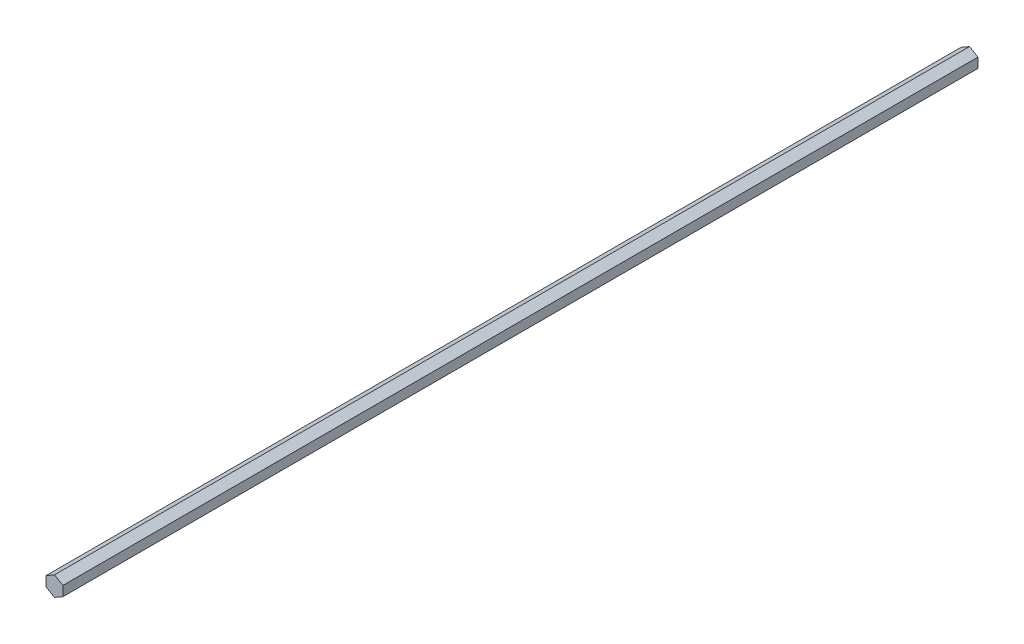
ISO-10303-21;
HEADER;
FILE_DESCRIPTION(('STEP AP214'),'2;1');
FILE_NAME('part.step','',(''),(''),'','','');
FILE_SCHEMA(('AUTOMOTIVE_DESIGN { 1 0 10303 214 1 1 1 1 }'));
ENDSEC;
DATA;
#1=APPLICATION_CONTEXT('core data for automotive mechanical design processes');
#2=APPLICATION_PROTOCOL_DEFINITION('international standard','automotive_design',2000,#1);
#3=PRODUCT_CONTEXT('',#1,'mechanical');
#4=PRODUCT('Part','Part','',(#3));
#5=PRODUCT_RELATED_PRODUCT_CATEGORY('part','',(#4));
#6=PRODUCT_DEFINITION_FORMATION('','',#4);
#7=PRODUCT_DEFINITION_CONTEXT('part definition',#1,'design');
#8=PRODUCT_DEFINITION('design','',#6,#7);
#9=PRODUCT_DEFINITION_SHAPE('','',#8);
#10=(LENGTH_UNIT() NAMED_UNIT(*) SI_UNIT(.MILLI.,.METRE.));
#11=(NAMED_UNIT(*) PLANE_ANGLE_UNIT() SI_UNIT($,.RADIAN.));
#12=(NAMED_UNIT(*) SI_UNIT($,.STERADIAN.) SOLID_ANGLE_UNIT());
#13=UNCERTAINTY_MEASURE_WITH_UNIT(LENGTH_MEASURE(1.E-05),#10,'distance_accuracy_value','');
#14=(GEOMETRIC_REPRESENTATION_CONTEXT(3) GLOBAL_UNCERTAINTY_ASSIGNED_CONTEXT((#13)) GLOBAL_UNIT_ASSIGNED_CONTEXT((#10,
#11,#12)) REPRESENTATION_CONTEXT('',''));
#15=CARTESIAN_POINT('',(0.,0.,0.));
#16=DIRECTION('',(0.,0.,1.));
#17=DIRECTION('',(1.,0.,0.));
#18=AXIS2_PLACEMENT_3D('',#15,#16,#17);
#19=CARTESIAN_POINT('',(6.35,-3.66617420935412,342.9));
#20=DIRECTION('',(-1.,0.,0.));
#21=DIRECTION('',(0.,-1.,0.));
#22=AXIS2_PLACEMENT_3D('',#19,#20,#21);
#23=PLANE('',#22);
#24=DIRECTION('',(0.,1.,0.));
#25=VECTOR('',#24,1.);
#26=CARTESIAN_POINT('',(6.35,-3.66617420935412,-342.9));
#27=LINE('',#26,#25);
#28=CARTESIAN_POINT('',(6.35,-3.66617420935412,-342.9));
#29=VERTEX_POINT('',#28);
#30=CARTESIAN_POINT('',(6.35,3.66617420935412,-342.9));
#31=VERTEX_POINT('',#30);
#32=EDGE_CURVE('E134',#29,#31,#27,.T.);
#33=ORIENTED_EDGE('',*,*,#32,.T.);
#34=DIRECTION('',(0.,0.,-1.));
#35=VECTOR('',#34,1.);
#36=CARTESIAN_POINT('',(6.35,3.66617420935412,342.9));
#37=LINE('',#36,#35);
#38=CARTESIAN_POINT('',(6.35,3.66617420935412,342.9));
#39=VERTEX_POINT('',#38);
#40=EDGE_CURVE('E11',#39,#31,#37,.T.);
#41=ORIENTED_EDGE('',*,*,#40,.F.);
#42=DIRECTION('',(0.,1.,0.));
#43=VECTOR('',#42,1.);
#44=CARTESIAN_POINT('',(6.35,-3.66617420935412,342.9));
#45=LINE('',#44,#43);
#46=CARTESIAN_POINT('',(6.35,-3.66617420935412,342.9));
#47=VERTEX_POINT('',#46);
#48=EDGE_CURVE('E150',#47,#39,#45,.T.);
#49=ORIENTED_EDGE('',*,*,#48,.F.);
#50=DIRECTION('',(0.,0.,-1.));
#51=VECTOR('',#50,1.);
#52=CARTESIAN_POINT('',(6.35,-3.66617420935412,342.9));
#53=LINE('',#52,#51);
#54=EDGE_CURVE('E130',#47,#29,#53,.T.);
#55=ORIENTED_EDGE('',*,*,#54,.T.);
#56=EDGE_LOOP('',(#33,#41,#49,#55));
#57=FACE_BOUND('',#56,.T.);
#58=ADVANCED_FACE('F45',(#57),#23,.F.);
#59=CARTESIAN_POINT('',(6.35,3.66617420935412,342.9));
#60=DIRECTION('',(-0.5,-0.866025403784439,0.));
#61=DIRECTION('',(0.866025403784439,-0.5,0.));
#62=AXIS2_PLACEMENT_3D('',#59,#60,#61);
#63=PLANE('',#62);
#64=DIRECTION('',(-0.866025403784439,0.5,0.));
#65=VECTOR('',#64,1.);
#66=CARTESIAN_POINT('',(6.35,3.66617420935412,-342.9));
#67=LINE('',#66,#65);
#68=CARTESIAN_POINT('',(0.,7.33234841870825,-342.9));
#69=VERTEX_POINT('',#68);
#70=EDGE_CURVE('E138',#31,#69,#67,.T.);
#71=ORIENTED_EDGE('',*,*,#70,.T.);
#72=DIRECTION('',(0.,0.,-1.));
#73=VECTOR('',#72,1.);
#74=CARTESIAN_POINT('',(0.,7.33234841870825,342.9));
#75=LINE('',#74,#73);
#76=CARTESIAN_POINT('',(0.,7.33234841870825,342.9));
#77=VERTEX_POINT('',#76);
#78=EDGE_CURVE('E54',#77,#69,#75,.T.);
#79=ORIENTED_EDGE('',*,*,#78,.F.);
#80=DIRECTION('',(-0.866025403784439,0.5,0.));
#81=VECTOR('',#80,1.);
#82=CARTESIAN_POINT('',(6.35,3.66617420935412,342.9));
#83=LINE('',#82,#81);
#84=EDGE_CURVE('E99',#39,#77,#83,.T.);
#85=ORIENTED_EDGE('',*,*,#84,.F.);
#86=ORIENTED_EDGE('',*,*,#40,.T.);
#87=EDGE_LOOP('',(#71,#79,#85,#86));
#88=FACE_BOUND('',#87,.T.);
#89=ADVANCED_FACE('F178',(#88),#63,.F.);
#90=CARTESIAN_POINT('',(0.,7.33234841870825,342.9));
#91=DIRECTION('',(0.5,-0.866025403784439,0.));
#92=DIRECTION('',(0.866025403784439,0.5,0.));
#93=AXIS2_PLACEMENT_3D('',#90,#91,#92);
#94=PLANE('',#93);
#95=DIRECTION('',(-0.866025403784439,-0.5,0.));
#96=VECTOR('',#95,1.);
#97=CARTESIAN_POINT('',(0.,7.33234841870825,-342.9));
#98=LINE('',#97,#96);
#99=CARTESIAN_POINT('',(-6.35,3.66617420935412,-342.9));
#100=VERTEX_POINT('',#99);
#101=EDGE_CURVE('E141',#69,#100,#98,.T.);
#102=ORIENTED_EDGE('',*,*,#101,.T.);
#103=DIRECTION('',(0.,0.,-1.));
#104=VECTOR('',#103,1.);
#105=CARTESIAN_POINT('',(-6.35,3.66617420935412,342.9));
#106=LINE('',#105,#104);
#107=CARTESIAN_POINT('',(-6.35,3.66617420935412,342.9));
#108=VERTEX_POINT('',#107);
#109=EDGE_CURVE('E123',#108,#100,#106,.T.);
#110=ORIENTED_EDGE('',*,*,#109,.F.);
#111=DIRECTION('',(-0.866025403784439,-0.5,0.));
#112=VECTOR('',#111,1.);
#113=CARTESIAN_POINT('',(0.,7.33234841870825,342.9));
#114=LINE('',#113,#112);
#115=EDGE_CURVE('E112',#77,#108,#114,.T.);
#116=ORIENTED_EDGE('',*,*,#115,.F.);
#117=ORIENTED_EDGE('',*,*,#78,.T.);
#118=EDGE_LOOP('',(#102,#110,#116,#117));
#119=FACE_BOUND('',#118,.T.);
#120=ADVANCED_FACE('F160',(#119),#94,.F.);
#121=CARTESIAN_POINT('',(-6.35,3.66617420935412,342.9));
#122=DIRECTION('',(1.,0.,0.));
#123=DIRECTION('',(0.,1.,0.));
#124=AXIS2_PLACEMENT_3D('',#121,#122,#123);
#125=PLANE('',#124);
#126=DIRECTION('',(0.,-1.,0.));
#127=VECTOR('',#126,1.);
#128=CARTESIAN_POINT('',(-6.35,3.66617420935412,-342.9));
#129=LINE('',#128,#127);
#130=CARTESIAN_POINT('',(-6.35,-3.66617420935412,-342.9));
#131=VERTEX_POINT('',#130);
#132=EDGE_CURVE('E121',#100,#131,#129,.T.);
#133=ORIENTED_EDGE('',*,*,#132,.T.);
#134=DIRECTION('',(0.,0.,-1.));
#135=VECTOR('',#134,1.);
#136=CARTESIAN_POINT('',(-6.35,-3.66617420935412,342.9));
#137=LINE('',#136,#135);
#138=CARTESIAN_POINT('',(-6.35,-3.66617420935412,342.9));
#139=VERTEX_POINT('',#138);
#140=EDGE_CURVE('E118',#139,#131,#137,.T.);
#141=ORIENTED_EDGE('',*,*,#140,.F.);
#142=DIRECTION('',(0.,-1.,0.));
#143=VECTOR('',#142,1.);
#144=CARTESIAN_POINT('',(-6.35,3.66617420935412,342.9));
#145=LINE('',#144,#143);
#146=EDGE_CURVE('E106',#108,#139,#145,.T.);
#147=ORIENTED_EDGE('',*,*,#146,.F.);
#148=ORIENTED_EDGE('',*,*,#109,.T.);
#149=EDGE_LOOP('',(#133,#141,#147,#148));
#150=FACE_BOUND('',#149,.T.);
#151=ADVANCED_FACE('F119',(#150),#125,.F.);
#152=CARTESIAN_POINT('',(-6.35,-3.66617420935412,342.9));
#153=DIRECTION('',(0.5,0.866025403784439,0.));
#154=DIRECTION('',(-0.866025403784439,0.5,0.));
#155=AXIS2_PLACEMENT_3D('',#152,#153,#154);
#156=PLANE('',#155);
#157=DIRECTION('',(0.866025403784439,-0.5,0.));
#158=VECTOR('',#157,1.);
#159=CARTESIAN_POINT('',(-6.35,-3.66617420935412,-342.9));
#160=LINE('',#159,#158);
#161=CARTESIAN_POINT('',(0.,-7.33234841870825,-342.9));
#162=VERTEX_POINT('',#161);
#163=EDGE_CURVE('E85',#131,#162,#160,.T.);
#164=ORIENTED_EDGE('',*,*,#163,.T.);
#165=DIRECTION('',(0.,0.,-1.));
#166=VECTOR('',#165,1.);
#167=CARTESIAN_POINT('',(0.,-7.33234841870825,342.9));
#168=LINE('',#167,#166);
#169=CARTESIAN_POINT('',(0.,-7.33234841870825,342.9));
#170=VERTEX_POINT('',#169);
#171=EDGE_CURVE('E124',#170,#162,#168,.T.);
#172=ORIENTED_EDGE('',*,*,#171,.F.);
#173=DIRECTION('',(0.866025403784439,-0.5,0.));
#174=VECTOR('',#173,1.);
#175=CARTESIAN_POINT('',(-6.35,-3.66617420935412,342.9));
#176=LINE('',#175,#174);
#177=EDGE_CURVE('E110',#139,#170,#176,.T.);
#178=ORIENTED_EDGE('',*,*,#177,.F.);
#179=ORIENTED_EDGE('',*,*,#140,.T.);
#180=EDGE_LOOP('',(#164,#172,#178,#179));
#181=FACE_BOUND('',#180,.T.);
#182=ADVANCED_FACE('F126',(#181),#156,.F.);
#183=CARTESIAN_POINT('',(0.,-7.33234841870825,342.9));
#184=DIRECTION('',(-0.5,0.866025403784439,0.));
#185=DIRECTION('',(-0.866025403784439,-0.5,0.));
#186=AXIS2_PLACEMENT_3D('',#183,#184,#185);
#187=PLANE('',#186);
#188=DIRECTION('',(0.866025403784438,0.5,0.));
#189=VECTOR('',#188,1.);
#190=CARTESIAN_POINT('',(0.,-7.33234841870825,-342.9));
#191=LINE('',#190,#189);
#192=EDGE_CURVE('E91',#162,#29,#191,.T.);
#193=ORIENTED_EDGE('',*,*,#192,.T.);
#194=ORIENTED_EDGE('',*,*,#54,.F.);
#195=DIRECTION('',(0.866025403784438,0.5,0.));
#196=VECTOR('',#195,1.);
#197=CARTESIAN_POINT('',(0.,-7.33234841870825,342.9));
#198=LINE('',#197,#196);
#199=EDGE_CURVE('E62',#170,#47,#198,.T.);
#200=ORIENTED_EDGE('',*,*,#199,.F.);
#201=ORIENTED_EDGE('',*,*,#171,.T.);
#202=EDGE_LOOP('',(#193,#194,#200,#201));
#203=FACE_BOUND('',#202,.T.);
#204=ADVANCED_FACE('F167',(#203),#187,.F.);
#205=CARTESIAN_POINT('',(0.,0.,342.9));
#206=DIRECTION('',(0.,0.,1.));
#207=DIRECTION('',(1.,0.,0.));
#208=AXIS2_PLACEMENT_3D('',#205,#206,#207);
#209=PLANE('',#208);
#210=ORIENTED_EDGE('',*,*,#48,.T.);
#211=ORIENTED_EDGE('',*,*,#84,.T.);
#212=ORIENTED_EDGE('',*,*,#115,.T.);
#213=ORIENTED_EDGE('',*,*,#146,.T.);
#214=ORIENTED_EDGE('',*,*,#177,.T.);
#215=ORIENTED_EDGE('',*,*,#199,.T.);
#216=EDGE_LOOP('',(#210,#211,#212,#213,#214,#215));
#217=FACE_BOUND('',#216,.T.);
#218=ADVANCED_FACE('F108',(#217),#209,.T.);
#219=CARTESIAN_POINT('',(0.,0.,-342.9));
#220=DIRECTION('',(0.,0.,1.));
#221=DIRECTION('',(1.,0.,0.));
#222=AXIS2_PLACEMENT_3D('',#219,#220,#221);
#223=PLANE('',#222);
#224=ORIENTED_EDGE('',*,*,#32,.F.);
#225=ORIENTED_EDGE('',*,*,#192,.F.);
#226=ORIENTED_EDGE('',*,*,#163,.F.);
#227=ORIENTED_EDGE('',*,*,#132,.F.);
#228=ORIENTED_EDGE('',*,*,#101,.F.);
#229=ORIENTED_EDGE('',*,*,#70,.F.);
#230=EDGE_LOOP('',(#224,#225,#226,#227,#228,#229));
#231=FACE_BOUND('',#230,.T.);
#232=ADVANCED_FACE('F163',(#231),#223,.F.);
#233=CLOSED_SHELL('',(#58,#89,#120,#151,#182,#204,#218,#232));
#234=MANIFOLD_SOLID_BREP('B2',#233);
#235=ADVANCED_BREP_SHAPE_REPRESENTATION('',(#18,#234),#14);
#236=SHAPE_DEFINITION_REPRESENTATION(#9,#235);
ENDSEC;
END-ISO-10303-21;
